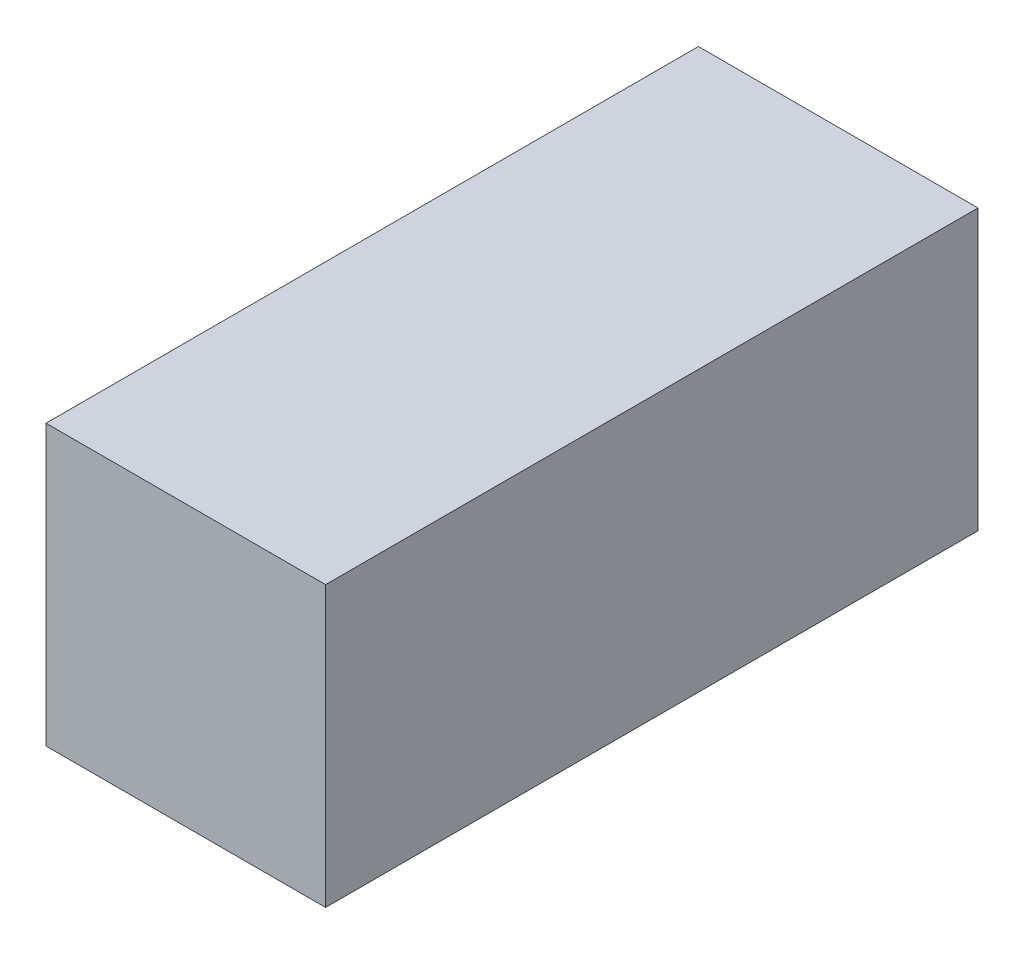
ISO-10303-21;
HEADER;
FILE_DESCRIPTION(('STEP AP214'),'2;1');
FILE_NAME('part.step','',(''),(''),'','','');
FILE_SCHEMA(('AUTOMOTIVE_DESIGN { 1 0 10303 214 1 1 1 1 }'));
ENDSEC;
DATA;
#1=APPLICATION_CONTEXT('core data for automotive mechanical design processes');
#2=APPLICATION_PROTOCOL_DEFINITION('international standard','automotive_design',2000,#1);
#3=PRODUCT_CONTEXT('',#1,'mechanical');
#4=PRODUCT('Part','Part','',(#3));
#5=PRODUCT_RELATED_PRODUCT_CATEGORY('part','',(#4));
#6=PRODUCT_DEFINITION_FORMATION('','',#4);
#7=PRODUCT_DEFINITION_CONTEXT('part definition',#1,'design');
#8=PRODUCT_DEFINITION('design','',#6,#7);
#9=PRODUCT_DEFINITION_SHAPE('','',#8);
#10=(LENGTH_UNIT() NAMED_UNIT(*) SI_UNIT(.MILLI.,.METRE.));
#11=(NAMED_UNIT(*) PLANE_ANGLE_UNIT() SI_UNIT($,.RADIAN.));
#12=(NAMED_UNIT(*) SI_UNIT($,.STERADIAN.) SOLID_ANGLE_UNIT());
#13=UNCERTAINTY_MEASURE_WITH_UNIT(LENGTH_MEASURE(1.E-05),#10,'distance_accuracy_value','');
#14=(GEOMETRIC_REPRESENTATION_CONTEXT(3) GLOBAL_UNCERTAINTY_ASSIGNED_CONTEXT((#13)) GLOBAL_UNIT_ASSIGNED_CONTEXT((#10,
#11,#12)) REPRESENTATION_CONTEXT('',''));
#15=CARTESIAN_POINT('',(0.,0.,0.));
#16=DIRECTION('',(0.,0.,1.));
#17=DIRECTION('',(1.,0.,0.));
#18=AXIS2_PLACEMENT_3D('',#15,#16,#17);
#19=CARTESIAN_POINT('',(-15.,15.,70.));
#20=DIRECTION('',(1.,0.,0.));
#21=DIRECTION('',(0.,1.,0.));
#22=AXIS2_PLACEMENT_3D('',#19,#20,#21);
#23=PLANE('',#22);
#24=DIRECTION('',(0.,-1.,0.));
#25=VECTOR('',#24,1.);
#26=CARTESIAN_POINT('',(-15.,15.,0.));
#27=LINE('',#26,#25);
#28=CARTESIAN_POINT('',(-15.,15.,0.));
#29=VERTEX_POINT('',#28);
#30=CARTESIAN_POINT('',(-15.,-15.,0.));
#31=VERTEX_POINT('',#30);
#32=EDGE_CURVE('E105',#29,#31,#27,.T.);
#33=ORIENTED_EDGE('',*,*,#32,.T.);
#34=DIRECTION('',(0.,0.,-1.));
#35=VECTOR('',#34,1.);
#36=CARTESIAN_POINT('',(-15.,-15.,70.));
#37=LINE('',#36,#35);
#38=CARTESIAN_POINT('',(-15.,-15.,70.));
#39=VERTEX_POINT('',#38);
#40=EDGE_CURVE('E11',#39,#31,#37,.T.);
#41=ORIENTED_EDGE('',*,*,#40,.F.);
#42=DIRECTION('',(0.,-1.,0.));
#43=VECTOR('',#42,1.);
#44=CARTESIAN_POINT('',(-15.,15.,70.));
#45=LINE('',#44,#43);
#46=CARTESIAN_POINT('',(-15.,15.,70.));
#47=VERTEX_POINT('',#46);
#48=EDGE_CURVE('E93',#47,#39,#45,.T.);
#49=ORIENTED_EDGE('',*,*,#48,.F.);
#50=DIRECTION('',(0.,0.,-1.));
#51=VECTOR('',#50,1.);
#52=CARTESIAN_POINT('',(-15.,15.,70.));
#53=LINE('',#52,#51);
#54=EDGE_CURVE('E101',#47,#29,#53,.T.);
#55=ORIENTED_EDGE('',*,*,#54,.T.);
#56=EDGE_LOOP('',(#33,#41,#49,#55));
#57=FACE_BOUND('',#56,.T.);
#58=ADVANCED_FACE('F42',(#57),#23,.F.);
#59=CARTESIAN_POINT('',(15.,-15.,70.));
#60=DIRECTION('',(0.,1.,0.));
#61=DIRECTION('',(-1.,0.,0.));
#62=AXIS2_PLACEMENT_3D('',#59,#60,#61);
#63=PLANE('',#62);
#64=DIRECTION('',(1.,0.,0.));
#65=VECTOR('',#64,1.);
#66=CARTESIAN_POINT('',(15.,-15.,0.));
#67=LINE('',#66,#65);
#68=CARTESIAN_POINT('',(15.,-15.,0.));
#69=VERTEX_POINT('',#68);
#70=EDGE_CURVE('E97',#31,#69,#67,.T.);
#71=ORIENTED_EDGE('',*,*,#70,.T.);
#72=DIRECTION('',(0.,0.,-1.));
#73=VECTOR('',#72,1.);
#74=CARTESIAN_POINT('',(15.,-15.,70.));
#75=LINE('',#74,#73);
#76=CARTESIAN_POINT('',(15.,-15.,70.));
#77=VERTEX_POINT('',#76);
#78=EDGE_CURVE('E50',#77,#69,#75,.T.);
#79=ORIENTED_EDGE('',*,*,#78,.F.);
#80=DIRECTION('',(1.,0.,0.));
#81=VECTOR('',#80,1.);
#82=CARTESIAN_POINT('',(15.,-15.,70.));
#83=LINE('',#82,#81);
#84=EDGE_CURVE('E88',#39,#77,#83,.T.);
#85=ORIENTED_EDGE('',*,*,#84,.F.);
#86=ORIENTED_EDGE('',*,*,#40,.T.);
#87=EDGE_LOOP('',(#71,#79,#85,#86));
#88=FACE_BOUND('',#87,.T.);
#89=ADVANCED_FACE('F96',(#88),#63,.F.);
#90=CARTESIAN_POINT('',(15.,15.,70.));
#91=DIRECTION('',(-1.,0.,0.));
#92=DIRECTION('',(0.,-1.,0.));
#93=AXIS2_PLACEMENT_3D('',#90,#91,#92);
#94=PLANE('',#93);
#95=DIRECTION('',(0.,1.,0.));
#96=VECTOR('',#95,1.);
#97=CARTESIAN_POINT('',(15.,15.,0.));
#98=LINE('',#97,#96);
#99=CARTESIAN_POINT('',(15.,15.,0.));
#100=VERTEX_POINT('',#99);
#101=EDGE_CURVE('E75',#69,#100,#98,.T.);
#102=ORIENTED_EDGE('',*,*,#101,.T.);
#103=DIRECTION('',(0.,0.,-1.));
#104=VECTOR('',#103,1.);
#105=CARTESIAN_POINT('',(15.,15.,70.));
#106=LINE('',#105,#104);
#107=CARTESIAN_POINT('',(15.,15.,70.));
#108=VERTEX_POINT('',#107);
#109=EDGE_CURVE('E98',#108,#100,#106,.T.);
#110=ORIENTED_EDGE('',*,*,#109,.F.);
#111=DIRECTION('',(0.,1.,0.));
#112=VECTOR('',#111,1.);
#113=CARTESIAN_POINT('',(15.,15.,70.));
#114=LINE('',#113,#112);
#115=EDGE_CURVE('E91',#77,#108,#114,.T.);
#116=ORIENTED_EDGE('',*,*,#115,.F.);
#117=ORIENTED_EDGE('',*,*,#78,.T.);
#118=EDGE_LOOP('',(#102,#110,#116,#117));
#119=FACE_BOUND('',#118,.T.);
#120=ADVANCED_FACE('F99',(#119),#94,.F.);
#121=CARTESIAN_POINT('',(15.,15.,70.));
#122=DIRECTION('',(0.,-1.,0.));
#123=DIRECTION('',(1.,0.,0.));
#124=AXIS2_PLACEMENT_3D('',#121,#122,#123);
#125=PLANE('',#124);
#126=DIRECTION('',(-1.,0.,0.));
#127=VECTOR('',#126,1.);
#128=CARTESIAN_POINT('',(15.,15.,0.));
#129=LINE('',#128,#127);
#130=EDGE_CURVE('E81',#100,#29,#129,.T.);
#131=ORIENTED_EDGE('',*,*,#130,.T.);
#132=ORIENTED_EDGE('',*,*,#54,.F.);
#133=DIRECTION('',(-1.,0.,0.));
#134=VECTOR('',#133,1.);
#135=CARTESIAN_POINT('',(15.,15.,70.));
#136=LINE('',#135,#134);
#137=EDGE_CURVE('E58',#108,#47,#136,.T.);
#138=ORIENTED_EDGE('',*,*,#137,.F.);
#139=ORIENTED_EDGE('',*,*,#109,.T.);
#140=EDGE_LOOP('',(#131,#132,#138,#139));
#141=FACE_BOUND('',#140,.T.);
#142=ADVANCED_FACE('F112',(#141),#125,.F.);
#143=CARTESIAN_POINT('',(0.,0.,70.));
#144=DIRECTION('',(0.,0.,-1.));
#145=DIRECTION('',(-1.,0.,0.));
#146=AXIS2_PLACEMENT_3D('',#143,#144,#145);
#147=PLANE('',#146);
#148=ORIENTED_EDGE('',*,*,#48,.T.);
#149=ORIENTED_EDGE('',*,*,#84,.T.);
#150=ORIENTED_EDGE('',*,*,#115,.T.);
#151=ORIENTED_EDGE('',*,*,#137,.T.);
#152=EDGE_LOOP('',(#148,#149,#150,#151));
#153=FACE_BOUND('',#152,.T.);
#154=ADVANCED_FACE('F89',(#153),#147,.F.);
#155=CARTESIAN_POINT('',(0.,0.,0.));
#156=DIRECTION('',(0.,0.,-1.));
#157=DIRECTION('',(-1.,0.,0.));
#158=AXIS2_PLACEMENT_3D('',#155,#156,#157);
#159=PLANE('',#158);
#160=ORIENTED_EDGE('',*,*,#32,.F.);
#161=ORIENTED_EDGE('',*,*,#130,.F.);
#162=ORIENTED_EDGE('',*,*,#101,.F.);
#163=ORIENTED_EDGE('',*,*,#70,.F.);
#164=EDGE_LOOP('',(#160,#161,#162,#163));
#165=FACE_BOUND('',#164,.T.);
#166=ADVANCED_FACE('F115',(#165),#159,.T.);
#167=CLOSED_SHELL('',(#58,#89,#120,#142,#154,#166));
#168=MANIFOLD_SOLID_BREP('B2',#167);
#169=ADVANCED_BREP_SHAPE_REPRESENTATION('',(#18,#168),#14);
#170=SHAPE_DEFINITION_REPRESENTATION(#9,#169);
ENDSEC;
END-ISO-10303-21;
